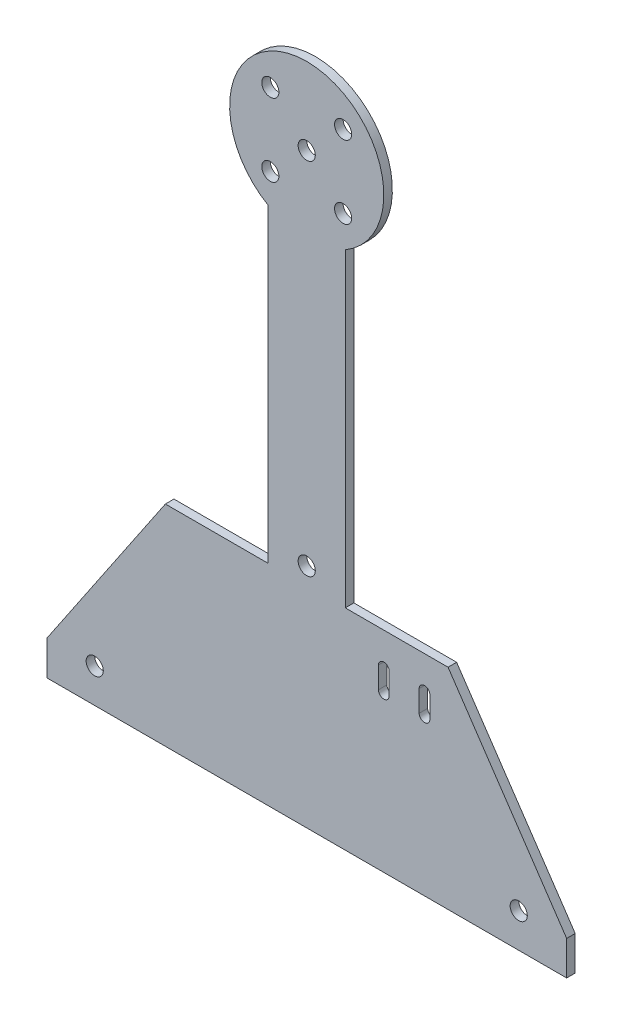
ISO-10303-21;
HEADER;
FILE_DESCRIPTION(('STEP AP214'),'2;1');
FILE_NAME('part.step','',(''),(''),'','','');
FILE_SCHEMA(('AUTOMOTIVE_DESIGN { 1 0 10303 214 1 1 1 1 }'));
ENDSEC;
DATA;
#1=APPLICATION_CONTEXT('core data for automotive mechanical design processes');
#2=APPLICATION_PROTOCOL_DEFINITION('international standard','automotive_design',2000,#1);
#3=PRODUCT_CONTEXT('',#1,'mechanical');
#4=PRODUCT('Part','Part','',(#3));
#5=PRODUCT_RELATED_PRODUCT_CATEGORY('part','',(#4));
#6=PRODUCT_DEFINITION_FORMATION('','',#4);
#7=PRODUCT_DEFINITION_CONTEXT('part definition',#1,'design');
#8=PRODUCT_DEFINITION('design','',#6,#7);
#9=PRODUCT_DEFINITION_SHAPE('','',#8);
#10=(LENGTH_UNIT() NAMED_UNIT(*) SI_UNIT(.MILLI.,.METRE.));
#11=(NAMED_UNIT(*) PLANE_ANGLE_UNIT() SI_UNIT($,.RADIAN.));
#12=(NAMED_UNIT(*) SI_UNIT($,.STERADIAN.) SOLID_ANGLE_UNIT());
#13=UNCERTAINTY_MEASURE_WITH_UNIT(LENGTH_MEASURE(1.E-05),#10,'distance_accuracy_value','');
#14=(GEOMETRIC_REPRESENTATION_CONTEXT(3) GLOBAL_UNCERTAINTY_ASSIGNED_CONTEXT((#13)) GLOBAL_UNIT_ASSIGNED_CONTEXT((#10,
#11,#12)) REPRESENTATION_CONTEXT('',''));
#15=CARTESIAN_POINT('',(0.,0.,0.));
#16=DIRECTION('',(0.,0.,1.));
#17=DIRECTION('',(1.,0.,0.));
#18=AXIS2_PLACEMENT_3D('',#15,#16,#17);
#19=CARTESIAN_POINT('',(-0.291428571428588,121.645714285714,2.));
#20=DIRECTION('',(0.,0.,-1.));
#21=DIRECTION('',(-1.,0.,0.));
#22=AXIS2_PLACEMENT_3D('',#19,#20,#21);
#23=CYLINDRICAL_SURFACE('',#22,18.);
#24=CARTESIAN_POINT('',(-0.291428571428588,121.645714285714,0.));
#25=DIRECTION('',(0.,0.,1.));
#26=DIRECTION('',(1.,0.,0.));
#27=AXIS2_PLACEMENT_3D('',#24,#25,#26);
#28=CIRCLE('',#27,18.);
#29=CARTESIAN_POINT('',(-9.29142857142858,106.057257017594,0.));
#30=VERTEX_POINT('',#29);
#31=CARTESIAN_POINT('',(8.7085714285714,106.057257017594,0.));
#32=VERTEX_POINT('',#31);
#33=EDGE_CURVE('E245',#30,#32,#28,.F.);
#34=ORIENTED_EDGE('',*,*,#33,.F.);
#35=DIRECTION('',(0.,0.,-1.));
#36=VECTOR('',#35,1.);
#37=CARTESIAN_POINT('',(-9.29142857142858,106.057257017594,2.));
#38=LINE('',#37,#36);
#39=CARTESIAN_POINT('',(-9.29142857142858,106.057257017594,2.));
#40=VERTEX_POINT('',#39);
#41=EDGE_CURVE('E11',#40,#30,#38,.T.);
#42=ORIENTED_EDGE('',*,*,#41,.F.);
#43=CARTESIAN_POINT('',(-0.291428571428588,121.645714285714,2.));
#44=DIRECTION('',(0.,0.,1.));
#45=DIRECTION('',(1.,0.,0.));
#46=AXIS2_PLACEMENT_3D('',#43,#44,#45);
#47=CIRCLE('',#46,18.);
#48=CARTESIAN_POINT('',(8.7085714285714,106.057257017594,2.));
#49=VERTEX_POINT('',#48);
#50=EDGE_CURVE('E361',#40,#49,#47,.F.);
#51=ORIENTED_EDGE('',*,*,#50,.T.);
#52=DIRECTION('',(0.,0.,-1.));
#53=VECTOR('',#52,1.);
#54=CARTESIAN_POINT('',(8.7085714285714,106.057257017594,2.));
#55=LINE('',#54,#53);
#56=EDGE_CURVE('E119',#49,#32,#55,.T.);
#57=ORIENTED_EDGE('',*,*,#56,.T.);
#58=EDGE_LOOP('',(#34,#42,#51,#57));
#59=FACE_BOUND('',#58,.T.);
#60=ADVANCED_FACE('F36',(#59),#23,.T.);
#61=CARTESIAN_POINT('',(-9.29142857142858,0.,2.));
#62=DIRECTION('',(-1.,0.,0.));
#63=DIRECTION('',(0.,0.,1.));
#64=AXIS2_PLACEMENT_3D('',#61,#62,#63);
#65=PLANE('',#64);
#66=DIRECTION('',(0.,1.,0.));
#67=VECTOR('',#66,1.);
#68=CARTESIAN_POINT('',(-9.29142857142858,0.,0.));
#69=LINE('',#68,#67);
#70=CARTESIAN_POINT('',(-9.29142857142858,33.6457142857143,0.));
#71=VERTEX_POINT('',#70);
#72=EDGE_CURVE('E248',#71,#30,#69,.T.);
#73=ORIENTED_EDGE('',*,*,#72,.F.);
#74=DIRECTION('',(0.,0.,-1.));
#75=VECTOR('',#74,1.);
#76=CARTESIAN_POINT('',(-9.29142857142858,33.6457142857143,2.));
#77=LINE('',#76,#75);
#78=CARTESIAN_POINT('',(-9.29142857142858,33.6457142857143,2.));
#79=VERTEX_POINT('',#78);
#80=EDGE_CURVE('E46',#79,#71,#77,.T.);
#81=ORIENTED_EDGE('',*,*,#80,.F.);
#82=DIRECTION('',(0.,1.,0.));
#83=VECTOR('',#82,1.);
#84=CARTESIAN_POINT('',(-9.29142857142858,0.,2.));
#85=LINE('',#84,#83);
#86=EDGE_CURVE('E363',#79,#40,#85,.T.);
#87=ORIENTED_EDGE('',*,*,#86,.T.);
#88=ORIENTED_EDGE('',*,*,#41,.T.);
#89=EDGE_LOOP('',(#73,#81,#87,#88));
#90=FACE_BOUND('',#89,.T.);
#91=ADVANCED_FACE('F386',(#90),#65,.T.);
#92=CARTESIAN_POINT('',(0.,33.6457142857143,2.));
#93=DIRECTION('',(0.,-1.,0.));
#94=DIRECTION('',(0.,0.,-1.));
#95=AXIS2_PLACEMENT_3D('',#92,#93,#94);
#96=PLANE('',#95);
#97=DIRECTION('',(-1.,0.,0.));
#98=VECTOR('',#97,1.);
#99=CARTESIAN_POINT('',(0.,33.6457142857143,0.));
#100=LINE('',#99,#98);
#101=CARTESIAN_POINT('',(-33.2914285714285,33.6457142857143,0.));
#102=VERTEX_POINT('',#101);
#103=EDGE_CURVE('E251',#71,#102,#100,.T.);
#104=ORIENTED_EDGE('',*,*,#103,.T.);
#105=DIRECTION('',(0.,0.,-1.));
#106=VECTOR('',#105,1.);
#107=CARTESIAN_POINT('',(-33.2914285714285,33.6457142857143,2.));
#108=LINE('',#107,#106);
#109=CARTESIAN_POINT('',(-33.2914285714285,33.6457142857143,2.));
#110=VERTEX_POINT('',#109);
#111=EDGE_CURVE('E305',#110,#102,#108,.T.);
#112=ORIENTED_EDGE('',*,*,#111,.F.);
#113=DIRECTION('',(-1.,0.,0.));
#114=VECTOR('',#113,1.);
#115=CARTESIAN_POINT('',(0.,33.6457142857143,2.));
#116=LINE('',#115,#114);
#117=EDGE_CURVE('E366',#79,#110,#116,.T.);
#118=ORIENTED_EDGE('',*,*,#117,.F.);
#119=ORIENTED_EDGE('',*,*,#80,.T.);
#120=EDGE_LOOP('',(#104,#112,#118,#119));
#121=FACE_BOUND('',#120,.T.);
#122=ADVANCED_FACE('F391',(#121),#96,.F.);
#123=CARTESIAN_POINT('',(-38.466867215642,25.9839493997509,2.));
#124=DIRECTION('',(0.828660684377225,-0.559751257405884,0.));
#125=DIRECTION('',(0.559751257405884,0.828660684377225,0.));
#126=AXIS2_PLACEMENT_3D('',#123,#124,#125);
#127=PLANE('',#126);
#128=DIRECTION('',(-0.559751257405884,-0.828660684377225,0.));
#129=VECTOR('',#128,1.);
#130=CARTESIAN_POINT('',(-38.466867215642,25.9839493997509,0.));
#131=LINE('',#130,#129);
#132=CARTESIAN_POINT('',(-60.9864815482557,-7.35428571428547,0.));
#133=VERTEX_POINT('',#132);
#134=EDGE_CURVE('E254',#102,#133,#131,.T.);
#135=ORIENTED_EDGE('',*,*,#134,.T.);
#136=DIRECTION('',(0.,0.,-1.));
#137=VECTOR('',#136,1.);
#138=CARTESIAN_POINT('',(-60.9864815482557,-7.35428571428547,2.));
#139=LINE('',#138,#137);
#140=CARTESIAN_POINT('',(-60.9864815482557,-7.35428571428547,2.));
#141=VERTEX_POINT('',#140);
#142=EDGE_CURVE('E302',#141,#133,#139,.T.);
#143=ORIENTED_EDGE('',*,*,#142,.F.);
#144=DIRECTION('',(-0.559751257405884,-0.828660684377225,0.));
#145=VECTOR('',#144,1.);
#146=CARTESIAN_POINT('',(-38.466867215642,25.9839493997509,2.));
#147=LINE('',#146,#145);
#148=EDGE_CURVE('E369',#110,#141,#147,.T.);
#149=ORIENTED_EDGE('',*,*,#148,.F.);
#150=ORIENTED_EDGE('',*,*,#111,.T.);
#151=EDGE_LOOP('',(#135,#143,#149,#150));
#152=FACE_BOUND('',#151,.T.);
#153=ADVANCED_FACE('F395',(#152),#127,.F.);
#154=CARTESIAN_POINT('',(-60.9864815482558,0.,2.));
#155=DIRECTION('',(1.,0.,0.));
#156=DIRECTION('',(0.,0.,-1.));
#157=AXIS2_PLACEMENT_3D('',#154,#155,#156);
#158=PLANE('',#157);
#159=DIRECTION('',(0.,-1.,0.));
#160=VECTOR('',#159,1.);
#161=CARTESIAN_POINT('',(-60.9864815482558,0.,0.));
#162=LINE('',#161,#160);
#163=CARTESIAN_POINT('',(-60.9864815482558,-15.3542857142855,0.));
#164=VERTEX_POINT('',#163);
#165=EDGE_CURVE('E257',#133,#164,#162,.T.);
#166=ORIENTED_EDGE('',*,*,#165,.T.);
#167=DIRECTION('',(0.,0.,-1.));
#168=VECTOR('',#167,1.);
#169=CARTESIAN_POINT('',(-60.9864815482558,-15.3542857142855,2.));
#170=LINE('',#169,#168);
#171=CARTESIAN_POINT('',(-60.9864815482558,-15.3542857142855,2.));
#172=VERTEX_POINT('',#171);
#173=EDGE_CURVE('E299',#172,#164,#170,.T.);
#174=ORIENTED_EDGE('',*,*,#173,.F.);
#175=DIRECTION('',(0.,-1.,0.));
#176=VECTOR('',#175,1.);
#177=CARTESIAN_POINT('',(-60.9864815482558,0.,2.));
#178=LINE('',#177,#176);
#179=EDGE_CURVE('E372',#141,#172,#178,.T.);
#180=ORIENTED_EDGE('',*,*,#179,.F.);
#181=ORIENTED_EDGE('',*,*,#142,.T.);
#182=EDGE_LOOP('',(#166,#174,#180,#181));
#183=FACE_BOUND('',#182,.T.);
#184=ADVANCED_FACE('F397',(#183),#158,.F.);
#185=CARTESIAN_POINT('',(0.,-15.3542857142855,2.));
#186=DIRECTION('',(0.,1.,0.));
#187=DIRECTION('',(0.,0.,1.));
#188=AXIS2_PLACEMENT_3D('',#185,#186,#187);
#189=PLANE('',#188);
#190=DIRECTION('',(1.,0.,0.));
#191=VECTOR('',#190,1.);
#192=CARTESIAN_POINT('',(0.,-15.3542857142855,0.));
#193=LINE('',#192,#191);
#194=CARTESIAN_POINT('',(60.4036244053986,-15.3542857142855,0.));
#195=VERTEX_POINT('',#194);
#196=EDGE_CURVE('E260',#164,#195,#193,.T.);
#197=ORIENTED_EDGE('',*,*,#196,.T.);
#198=DIRECTION('',(0.,0.,-1.));
#199=VECTOR('',#198,1.);
#200=CARTESIAN_POINT('',(60.4036244053986,-15.3542857142855,2.));
#201=LINE('',#200,#199);
#202=CARTESIAN_POINT('',(60.4036244053986,-15.3542857142855,2.));
#203=VERTEX_POINT('',#202);
#204=EDGE_CURVE('E297',#203,#195,#201,.T.);
#205=ORIENTED_EDGE('',*,*,#204,.F.);
#206=DIRECTION('',(1.,0.,0.));
#207=VECTOR('',#206,1.);
#208=CARTESIAN_POINT('',(0.,-15.3542857142855,2.));
#209=LINE('',#208,#207);
#210=EDGE_CURVE('E375',#172,#203,#209,.T.);
#211=ORIENTED_EDGE('',*,*,#210,.F.);
#212=ORIENTED_EDGE('',*,*,#173,.T.);
#213=EDGE_LOOP('',(#197,#205,#211,#212));
#214=FACE_BOUND('',#213,.T.);
#215=ADVANCED_FACE('F399',(#214),#189,.F.);
#216=CARTESIAN_POINT('',(60.4036244053986,0.,2.));
#217=DIRECTION('',(1.,0.,0.));
#218=DIRECTION('',(0.,0.,-1.));
#219=AXIS2_PLACEMENT_3D('',#216,#217,#218);
#220=PLANE('',#219);
#221=DIRECTION('',(0.,-1.,0.));
#222=VECTOR('',#221,1.);
#223=CARTESIAN_POINT('',(60.4036244053986,0.,0.));
#224=LINE('',#223,#222);
#225=CARTESIAN_POINT('',(60.4036244053986,-7.35428571428548,0.));
#226=VERTEX_POINT('',#225);
#227=EDGE_CURVE('E263',#226,#195,#224,.T.);
#228=ORIENTED_EDGE('',*,*,#227,.F.);
#229=DIRECTION('',(0.,0.,-1.));
#230=VECTOR('',#229,1.);
#231=CARTESIAN_POINT('',(60.4036244053986,-7.35428571428548,2.));
#232=LINE('',#231,#230);
#233=CARTESIAN_POINT('',(60.4036244053986,-7.35428571428548,2.));
#234=VERTEX_POINT('',#233);
#235=EDGE_CURVE('E182',#234,#226,#232,.T.);
#236=ORIENTED_EDGE('',*,*,#235,.F.);
#237=DIRECTION('',(0.,-1.,0.));
#238=VECTOR('',#237,1.);
#239=CARTESIAN_POINT('',(60.4036244053986,0.,2.));
#240=LINE('',#239,#238);
#241=EDGE_CURVE('E189',#234,#203,#240,.T.);
#242=ORIENTED_EDGE('',*,*,#241,.T.);
#243=ORIENTED_EDGE('',*,*,#204,.T.);
#244=EDGE_LOOP('',(#228,#236,#242,#243));
#245=FACE_BOUND('',#244,.T.);
#246=ADVANCED_FACE('F378',(#245),#220,.T.);
#247=CARTESIAN_POINT('',(38.0666317296824,25.7135946927544,2.));
#248=DIRECTION('',(0.828660684377225,0.559751257405884,0.));
#249=DIRECTION('',(-0.559751257405884,0.828660684377225,0.));
#250=AXIS2_PLACEMENT_3D('',#247,#248,#249);
#251=PLANE('',#250);
#252=DIRECTION('',(0.559751257405884,-0.828660684377225,0.));
#253=VECTOR('',#252,1.);
#254=CARTESIAN_POINT('',(38.0666317296824,25.7135946927544,0.));
#255=LINE('',#254,#253);
#256=CARTESIAN_POINT('',(32.7085714285713,33.6457142857143,0.));
#257=VERTEX_POINT('',#256);
#258=EDGE_CURVE('E177',#257,#226,#255,.T.);
#259=ORIENTED_EDGE('',*,*,#258,.F.);
#260=DIRECTION('',(0.,0.,-1.));
#261=VECTOR('',#260,1.);
#262=CARTESIAN_POINT('',(32.7085714285713,33.6457142857143,2.));
#263=LINE('',#262,#261);
#264=CARTESIAN_POINT('',(32.7085714285713,33.6457142857143,2.));
#265=VERTEX_POINT('',#264);
#266=EDGE_CURVE('E172',#265,#257,#263,.T.);
#267=ORIENTED_EDGE('',*,*,#266,.F.);
#268=DIRECTION('',(0.559751257405884,-0.828660684377225,0.));
#269=VECTOR('',#268,1.);
#270=CARTESIAN_POINT('',(38.0666317296824,25.7135946927544,2.));
#271=LINE('',#270,#269);
#272=EDGE_CURVE('E175',#265,#234,#271,.T.);
#273=ORIENTED_EDGE('',*,*,#272,.T.);
#274=ORIENTED_EDGE('',*,*,#235,.T.);
#275=EDGE_LOOP('',(#259,#267,#273,#274));
#276=FACE_BOUND('',#275,.T.);
#277=ADVANCED_FACE('F174',(#276),#251,.T.);
#278=CARTESIAN_POINT('',(0.,33.6457142857143,2.));
#279=DIRECTION('',(0.,1.,0.));
#280=DIRECTION('',(0.,0.,1.));
#281=AXIS2_PLACEMENT_3D('',#278,#279,#280);
#282=PLANE('',#281);
#283=DIRECTION('',(1.,0.,0.));
#284=VECTOR('',#283,1.);
#285=CARTESIAN_POINT('',(0.,33.6457142857143,0.));
#286=LINE('',#285,#284);
#287=CARTESIAN_POINT('',(8.7085714285714,33.6457142857143,0.));
#288=VERTEX_POINT('',#287);
#289=EDGE_CURVE('E267',#288,#257,#286,.T.);
#290=ORIENTED_EDGE('',*,*,#289,.F.);
#291=DIRECTION('',(0.,0.,-1.));
#292=VECTOR('',#291,1.);
#293=CARTESIAN_POINT('',(8.7085714285714,33.6457142857143,2.));
#294=LINE('',#293,#292);
#295=CARTESIAN_POINT('',(8.7085714285714,33.6457142857143,2.));
#296=VERTEX_POINT('',#295);
#297=EDGE_CURVE('E112',#296,#288,#294,.T.);
#298=ORIENTED_EDGE('',*,*,#297,.F.);
#299=DIRECTION('',(1.,0.,0.));
#300=VECTOR('',#299,1.);
#301=CARTESIAN_POINT('',(0.,33.6457142857143,2.));
#302=LINE('',#301,#300);
#303=EDGE_CURVE('E187',#296,#265,#302,.T.);
#304=ORIENTED_EDGE('',*,*,#303,.T.);
#305=ORIENTED_EDGE('',*,*,#266,.T.);
#306=EDGE_LOOP('',(#290,#298,#304,#305));
#307=FACE_BOUND('',#306,.T.);
#308=ADVANCED_FACE('F191',(#307),#282,.T.);
#309=CARTESIAN_POINT('',(17.7031309841158,20.9457142857143,2.));
#310=DIRECTION('',(0.,0.,-1.));
#311=DIRECTION('',(-1.,0.,0.));
#312=AXIS2_PLACEMENT_3D('',#309,#310,#311);
#313=CYLINDRICAL_SURFACE('',#312,1.25);
#314=CARTESIAN_POINT('',(17.7031309841158,20.9457142857143,0.));
#315=DIRECTION('',(0.,0.,1.));
#316=DIRECTION('',(1.,0.,0.));
#317=AXIS2_PLACEMENT_3D('',#314,#315,#316);
#318=CIRCLE('',#317,1.25);
#319=CARTESIAN_POINT('',(16.4531309841158,20.9457142857143,0.));
#320=VERTEX_POINT('',#319);
#321=CARTESIAN_POINT('',(18.9531309841158,20.9457142857143,0.));
#322=VERTEX_POINT('',#321);
#323=EDGE_CURVE('E230',#320,#322,#318,.T.);
#324=ORIENTED_EDGE('',*,*,#323,.F.);
#325=DIRECTION('',(0.,0.,-1.));
#326=VECTOR('',#325,1.);
#327=CARTESIAN_POINT('',(16.4531309841158,20.9457142857143,2.));
#328=LINE('',#327,#326);
#329=CARTESIAN_POINT('',(16.4531309841158,20.9457142857143,2.));
#330=VERTEX_POINT('',#329);
#331=EDGE_CURVE('E294',#330,#320,#328,.T.);
#332=ORIENTED_EDGE('',*,*,#331,.F.);
#333=CARTESIAN_POINT('',(17.7031309841158,20.9457142857143,2.));
#334=DIRECTION('',(0.,0.,1.));
#335=DIRECTION('',(1.,0.,0.));
#336=AXIS2_PLACEMENT_3D('',#333,#334,#335);
#337=CIRCLE('',#336,1.25);
#338=CARTESIAN_POINT('',(18.9531309841158,20.9457142857143,2.));
#339=VERTEX_POINT('',#338);
#340=EDGE_CURVE('E341',#330,#339,#337,.T.);
#341=ORIENTED_EDGE('',*,*,#340,.T.);
#342=DIRECTION('',(0.,0.,-1.));
#343=VECTOR('',#342,1.);
#344=CARTESIAN_POINT('',(18.9531309841158,20.9457142857143,2.));
#345=LINE('',#344,#343);
#346=EDGE_CURVE('E309',#339,#322,#345,.T.);
#347=ORIENTED_EDGE('',*,*,#346,.T.);
#348=EDGE_LOOP('',(#324,#332,#341,#347));
#349=FACE_BOUND('',#348,.T.);
#350=ADVANCED_FACE('F431',(#349),#313,.F.);
#351=CARTESIAN_POINT('',(16.4531309841158,0.,2.));
#352=DIRECTION('',(1.,0.,0.));
#353=DIRECTION('',(0.,0.,-1.));
#354=AXIS2_PLACEMENT_3D('',#351,#352,#353);
#355=PLANE('',#354);
#356=DIRECTION('',(0.,-1.,0.));
#357=VECTOR('',#356,1.);
#358=CARTESIAN_POINT('',(16.4531309841158,0.,0.));
#359=LINE('',#358,#357);
#360=CARTESIAN_POINT('',(16.4531309841158,25.9457142857143,0.));
#361=VERTEX_POINT('',#360);
#362=EDGE_CURVE('E233',#361,#320,#359,.T.);
#363=ORIENTED_EDGE('',*,*,#362,.F.);
#364=DIRECTION('',(0.,0.,-1.));
#365=VECTOR('',#364,1.);
#366=CARTESIAN_POINT('',(16.4531309841158,25.9457142857143,2.));
#367=LINE('',#366,#365);
#368=CARTESIAN_POINT('',(16.4531309841158,25.9457142857143,2.));
#369=VERTEX_POINT('',#368);
#370=EDGE_CURVE('E313',#369,#361,#367,.T.);
#371=ORIENTED_EDGE('',*,*,#370,.F.);
#372=DIRECTION('',(0.,-1.,0.));
#373=VECTOR('',#372,1.);
#374=CARTESIAN_POINT('',(16.4531309841158,0.,2.));
#375=LINE('',#374,#373);
#376=EDGE_CURVE('E350',#369,#330,#375,.T.);
#377=ORIENTED_EDGE('',*,*,#376,.T.);
#378=ORIENTED_EDGE('',*,*,#331,.T.);
#379=EDGE_LOOP('',(#363,#371,#377,#378));
#380=FACE_BOUND('',#379,.T.);
#381=ADVANCED_FACE('F427',(#380),#355,.T.);
#382=CARTESIAN_POINT('',(17.7031309841158,25.9457142857143,2.));
#383=DIRECTION('',(0.,0.,-1.));
#384=DIRECTION('',(-1.,0.,0.));
#385=AXIS2_PLACEMENT_3D('',#382,#383,#384);
#386=CYLINDRICAL_SURFACE('',#385,1.25);
#387=CARTESIAN_POINT('',(17.7031309841158,25.9457142857143,0.));
#388=DIRECTION('',(0.,0.,1.));
#389=DIRECTION('',(1.,0.,0.));
#390=AXIS2_PLACEMENT_3D('',#387,#388,#389);
#391=CIRCLE('',#390,1.25);
#392=CARTESIAN_POINT('',(18.9531309841158,25.9457142857143,0.));
#393=VERTEX_POINT('',#392);
#394=EDGE_CURVE('E236',#393,#361,#391,.T.);
#395=ORIENTED_EDGE('',*,*,#394,.F.);
#396=DIRECTION('',(0.,0.,-1.));
#397=VECTOR('',#396,1.);
#398=CARTESIAN_POINT('',(18.9531309841158,25.9457142857143,2.));
#399=LINE('',#398,#397);
#400=CARTESIAN_POINT('',(18.9531309841158,25.9457142857143,2.));
#401=VERTEX_POINT('',#400);
#402=EDGE_CURVE('E311',#401,#393,#399,.T.);
#403=ORIENTED_EDGE('',*,*,#402,.F.);
#404=CARTESIAN_POINT('',(17.7031309841158,25.9457142857143,2.));
#405=DIRECTION('',(0.,0.,1.));
#406=DIRECTION('',(1.,0.,0.));
#407=AXIS2_PLACEMENT_3D('',#404,#405,#406);
#408=CIRCLE('',#407,1.25);
#409=EDGE_CURVE('E353',#401,#369,#408,.T.);
#410=ORIENTED_EDGE('',*,*,#409,.T.);
#411=ORIENTED_EDGE('',*,*,#370,.T.);
#412=EDGE_LOOP('',(#395,#403,#410,#411));
#413=FACE_BOUND('',#412,.T.);
#414=ADVANCED_FACE('F424',(#413),#386,.F.);
#415=CARTESIAN_POINT('',(27.2031309841158,20.9457142857143,2.));
#416=DIRECTION('',(0.,0.,-1.));
#417=DIRECTION('',(-1.,0.,0.));
#418=AXIS2_PLACEMENT_3D('',#415,#416,#417);
#419=CYLINDRICAL_SURFACE('',#418,1.25);
#420=CARTESIAN_POINT('',(27.2031309841158,20.9457142857143,0.));
#421=DIRECTION('',(0.,0.,1.));
#422=DIRECTION('',(1.,0.,0.));
#423=AXIS2_PLACEMENT_3D('',#420,#421,#422);
#424=CIRCLE('',#423,1.25);
#425=CARTESIAN_POINT('',(25.9531309841158,20.9457142857143,0.));
#426=VERTEX_POINT('',#425);
#427=CARTESIAN_POINT('',(28.4531309841158,20.9457142857143,0.));
#428=VERTEX_POINT('',#427);
#429=EDGE_CURVE('E218',#426,#428,#424,.T.);
#430=ORIENTED_EDGE('',*,*,#429,.F.);
#431=DIRECTION('',(0.,0.,-1.));
#432=VECTOR('',#431,1.);
#433=CARTESIAN_POINT('',(25.9531309841158,20.9457142857143,2.));
#434=LINE('',#433,#432);
#435=CARTESIAN_POINT('',(25.9531309841158,20.9457142857143,2.));
#436=VERTEX_POINT('',#435);
#437=EDGE_CURVE('E40',#436,#426,#434,.T.);
#438=ORIENTED_EDGE('',*,*,#437,.F.);
#439=CARTESIAN_POINT('',(27.2031309841158,20.9457142857143,2.));
#440=DIRECTION('',(0.,0.,1.));
#441=DIRECTION('',(1.,0.,0.));
#442=AXIS2_PLACEMENT_3D('',#439,#440,#441);
#443=CIRCLE('',#442,1.25);
#444=CARTESIAN_POINT('',(28.4531309841158,20.9457142857143,2.));
#445=VERTEX_POINT('',#444);
#446=EDGE_CURVE('E292',#436,#445,#443,.T.);
#447=ORIENTED_EDGE('',*,*,#446,.T.);
#448=DIRECTION('',(0.,0.,-1.));
#449=VECTOR('',#448,1.);
#450=CARTESIAN_POINT('',(28.4531309841158,20.9457142857143,2.));
#451=LINE('',#450,#449);
#452=EDGE_CURVE('E217',#445,#428,#451,.T.);
#453=ORIENTED_EDGE('',*,*,#452,.T.);
#454=EDGE_LOOP('',(#430,#438,#447,#453));
#455=FACE_BOUND('',#454,.T.);
#456=ADVANCED_FACE('F38',(#455),#419,.F.);
#457=CARTESIAN_POINT('',(25.9531309841158,0.,2.));
#458=DIRECTION('',(1.,0.,0.));
#459=DIRECTION('',(0.,0.,-1.));
#460=AXIS2_PLACEMENT_3D('',#457,#458,#459);
#461=PLANE('',#460);
#462=DIRECTION('',(0.,-1.,0.));
#463=VECTOR('',#462,1.);
#464=CARTESIAN_POINT('',(25.9531309841158,0.,0.));
#465=LINE('',#464,#463);
#466=CARTESIAN_POINT('',(25.9531309841158,25.9457142857143,0.));
#467=VERTEX_POINT('',#466);
#468=EDGE_CURVE('E221',#467,#426,#465,.T.);
#469=ORIENTED_EDGE('',*,*,#468,.F.);
#470=DIRECTION('',(0.,0.,-1.));
#471=VECTOR('',#470,1.);
#472=CARTESIAN_POINT('',(25.9531309841158,25.9457142857143,2.));
#473=LINE('',#472,#471);
#474=CARTESIAN_POINT('',(25.9531309841158,25.9457142857143,2.));
#475=VERTEX_POINT('',#474);
#476=EDGE_CURVE('E318',#475,#467,#473,.T.);
#477=ORIENTED_EDGE('',*,*,#476,.F.);
#478=DIRECTION('',(0.,-1.,0.));
#479=VECTOR('',#478,1.);
#480=CARTESIAN_POINT('',(25.9531309841158,0.,2.));
#481=LINE('',#480,#479);
#482=EDGE_CURVE('E327',#475,#436,#481,.T.);
#483=ORIENTED_EDGE('',*,*,#482,.T.);
#484=ORIENTED_EDGE('',*,*,#437,.T.);
#485=EDGE_LOOP('',(#469,#477,#483,#484));
#486=FACE_BOUND('',#485,.T.);
#487=ADVANCED_FACE('F325',(#486),#461,.T.);
#488=CARTESIAN_POINT('',(27.2031309841158,25.9457142857143,2.));
#489=DIRECTION('',(0.,0.,-1.));
#490=DIRECTION('',(-1.,0.,0.));
#491=AXIS2_PLACEMENT_3D('',#488,#489,#490);
#492=CYLINDRICAL_SURFACE('',#491,1.25);
#493=CARTESIAN_POINT('',(27.2031309841158,25.9457142857143,0.));
#494=DIRECTION('',(0.,0.,1.));
#495=DIRECTION('',(1.,0.,0.));
#496=AXIS2_PLACEMENT_3D('',#493,#494,#495);
#497=CIRCLE('',#496,1.25);
#498=CARTESIAN_POINT('',(28.4531309841158,25.9457142857143,0.));
#499=VERTEX_POINT('',#498);
#500=EDGE_CURVE('E224',#499,#467,#497,.T.);
#501=ORIENTED_EDGE('',*,*,#500,.F.);
#502=DIRECTION('',(0.,0.,-1.));
#503=VECTOR('',#502,1.);
#504=CARTESIAN_POINT('',(28.4531309841158,25.9457142857143,2.));
#505=LINE('',#504,#503);
#506=CARTESIAN_POINT('',(28.4531309841158,25.9457142857143,2.));
#507=VERTEX_POINT('',#506);
#508=EDGE_CURVE('E317',#507,#499,#505,.T.);
#509=ORIENTED_EDGE('',*,*,#508,.F.);
#510=CARTESIAN_POINT('',(27.2031309841158,25.9457142857143,2.));
#511=DIRECTION('',(0.,0.,1.));
#512=DIRECTION('',(1.,0.,0.));
#513=AXIS2_PLACEMENT_3D('',#510,#511,#512);
#514=CIRCLE('',#513,1.25);
#515=EDGE_CURVE('E336',#507,#475,#514,.T.);
#516=ORIENTED_EDGE('',*,*,#515,.T.);
#517=ORIENTED_EDGE('',*,*,#476,.T.);
#518=EDGE_LOOP('',(#501,#509,#516,#517));
#519=FACE_BOUND('',#518,.T.);
#520=ADVANCED_FACE('F333',(#519),#492,.F.);
#521=CARTESIAN_POINT('',(49.2085714285714,-7.3542857142857,2.));
#522=DIRECTION('',(0.,0.,-1.));
#523=DIRECTION('',(-1.,0.,0.));
#524=AXIS2_PLACEMENT_3D('',#521,#522,#523);
#525=CYLINDRICAL_SURFACE('',#524,2.);
#526=CARTESIAN_POINT('',(49.2085714285714,-7.3542857142857,2.));
#527=DIRECTION('',(0.,0.,1.));
#528=DIRECTION('',(1.,0.,0.));
#529=AXIS2_PLACEMENT_3D('',#526,#527,#528);
#530=CIRCLE('',#529,2.);
#531=CARTESIAN_POINT('',(51.2085714285714,-7.3542857142857,2.));
#532=VERTEX_POINT('',#531);
#533=EDGE_CURVE('E211',#532,#532,#530,.T.);
#534=ORIENTED_EDGE('',*,*,#533,.T.);
#535=EDGE_LOOP('',(#534));
#536=FACE_BOUND('',#535,.T.);
#537=CARTESIAN_POINT('',(49.2085714285714,-7.3542857142857,0.));
#538=DIRECTION('',(0.,0.,1.));
#539=DIRECTION('',(1.,0.,0.));
#540=AXIS2_PLACEMENT_3D('',#537,#538,#539);
#541=CIRCLE('',#540,2.);
#542=CARTESIAN_POINT('',(51.2085714285714,-7.3542857142857,0.));
#543=VERTEX_POINT('',#542);
#544=EDGE_CURVE('E286',#543,#543,#541,.T.);
#545=ORIENTED_EDGE('',*,*,#544,.F.);
#546=EDGE_LOOP('',(#545));
#547=FACE_BOUND('',#546,.T.);
#548=ADVANCED_FACE('F440',(#536,#547),#525,.F.);
#549=CARTESIAN_POINT('',(8.20857142857141,130.145714285714,2.));
#550=DIRECTION('',(0.,0.,-1.));
#551=DIRECTION('',(-1.,0.,0.));
#552=AXIS2_PLACEMENT_3D('',#549,#550,#551);
#553=CYLINDRICAL_SURFACE('',#552,2.);
#554=CARTESIAN_POINT('',(8.20857142857141,130.145714285714,2.));
#555=DIRECTION('',(0.,0.,1.));
#556=DIRECTION('',(1.,0.,0.));
#557=AXIS2_PLACEMENT_3D('',#554,#555,#556);
#558=CIRCLE('',#557,2.);
#559=CARTESIAN_POINT('',(10.2085714285714,130.145714285714,2.));
#560=VERTEX_POINT('',#559);
#561=EDGE_CURVE('E208',#560,#560,#558,.T.);
#562=ORIENTED_EDGE('',*,*,#561,.T.);
#563=EDGE_LOOP('',(#562));
#564=FACE_BOUND('',#563,.T.);
#565=CARTESIAN_POINT('',(8.20857142857141,130.145714285714,0.));
#566=DIRECTION('',(0.,0.,1.));
#567=DIRECTION('',(1.,0.,0.));
#568=AXIS2_PLACEMENT_3D('',#565,#566,#567);
#569=CIRCLE('',#568,2.);
#570=CARTESIAN_POINT('',(10.2085714285714,130.145714285714,0.));
#571=VERTEX_POINT('',#570);
#572=EDGE_CURVE('E283',#571,#571,#569,.T.);
#573=ORIENTED_EDGE('',*,*,#572,.F.);
#574=EDGE_LOOP('',(#573));
#575=FACE_BOUND('',#574,.T.);
#576=ADVANCED_FACE('F544',(#564,#575),#553,.F.);
#577=CARTESIAN_POINT('',(-0.291428571428588,37.6457142857143,2.));
#578=DIRECTION('',(0.,0.,-1.));
#579=DIRECTION('',(-1.,0.,0.));
#580=AXIS2_PLACEMENT_3D('',#577,#578,#579);
#581=CYLINDRICAL_SURFACE('',#580,2.);
#582=CARTESIAN_POINT('',(-0.291428571428588,37.6457142857143,2.));
#583=DIRECTION('',(0.,0.,1.));
#584=DIRECTION('',(1.,0.,0.));
#585=AXIS2_PLACEMENT_3D('',#582,#583,#584);
#586=CIRCLE('',#585,2.);
#587=CARTESIAN_POINT('',(1.70857142857141,37.6457142857143,2.));
#588=VERTEX_POINT('',#587);
#589=EDGE_CURVE('E205',#588,#588,#586,.T.);
#590=ORIENTED_EDGE('',*,*,#589,.T.);
#591=EDGE_LOOP('',(#590));
#592=FACE_BOUND('',#591,.T.);
#593=CARTESIAN_POINT('',(-0.291428571428588,37.6457142857143,0.));
#594=DIRECTION('',(0.,0.,1.));
#595=DIRECTION('',(1.,0.,0.));
#596=AXIS2_PLACEMENT_3D('',#593,#594,#595);
#597=CIRCLE('',#596,2.);
#598=CARTESIAN_POINT('',(1.70857142857141,37.6457142857143,0.));
#599=VERTEX_POINT('',#598);
#600=EDGE_CURVE('E280',#599,#599,#597,.T.);
#601=ORIENTED_EDGE('',*,*,#600,.F.);
#602=EDGE_LOOP('',(#601));
#603=FACE_BOUND('',#602,.T.);
#604=ADVANCED_FACE('F553',(#592,#603),#581,.F.);
#605=CARTESIAN_POINT('',(8.20857142857163,113.145714285714,2.));
#606=DIRECTION('',(0.,0.,-1.));
#607=DIRECTION('',(-1.,0.,0.));
#608=AXIS2_PLACEMENT_3D('',#605,#606,#607);
#609=CYLINDRICAL_SURFACE('',#608,2.);
#610=CARTESIAN_POINT('',(8.20857142857163,113.145714285714,2.));
#611=DIRECTION('',(0.,0.,1.));
#612=DIRECTION('',(1.,0.,0.));
#613=AXIS2_PLACEMENT_3D('',#610,#611,#612);
#614=CIRCLE('',#613,2.);
#615=CARTESIAN_POINT('',(10.2085714285716,113.145714285714,2.));
#616=VERTEX_POINT('',#615);
#617=EDGE_CURVE('E202',#616,#616,#614,.T.);
#618=ORIENTED_EDGE('',*,*,#617,.T.);
#619=EDGE_LOOP('',(#618));
#620=FACE_BOUND('',#619,.T.);
#621=CARTESIAN_POINT('',(8.20857142857163,113.145714285714,0.));
#622=DIRECTION('',(0.,0.,1.));
#623=DIRECTION('',(1.,0.,0.));
#624=AXIS2_PLACEMENT_3D('',#621,#622,#623);
#625=CIRCLE('',#624,2.);
#626=CARTESIAN_POINT('',(10.2085714285716,113.145714285714,0.));
#627=VERTEX_POINT('',#626);
#628=EDGE_CURVE('E277',#627,#627,#625,.T.);
#629=ORIENTED_EDGE('',*,*,#628,.F.);
#630=EDGE_LOOP('',(#629));
#631=FACE_BOUND('',#630,.T.);
#632=ADVANCED_FACE('F562',(#620,#631),#609,.F.);
#633=CARTESIAN_POINT('',(-8.7914285714284,113.145714285714,2.));
#634=DIRECTION('',(0.,0.,-1.));
#635=DIRECTION('',(-1.,0.,0.));
#636=AXIS2_PLACEMENT_3D('',#633,#634,#635);
#637=CYLINDRICAL_SURFACE('',#636,2.);
#638=CARTESIAN_POINT('',(-8.7914285714284,113.145714285714,2.));
#639=DIRECTION('',(0.,0.,1.));
#640=DIRECTION('',(1.,0.,0.));
#641=AXIS2_PLACEMENT_3D('',#638,#639,#640);
#642=CIRCLE('',#641,2.);
#643=CARTESIAN_POINT('',(-6.79142857142841,113.145714285714,2.));
#644=VERTEX_POINT('',#643);
#645=EDGE_CURVE('E199',#644,#644,#642,.T.);
#646=ORIENTED_EDGE('',*,*,#645,.T.);
#647=EDGE_LOOP('',(#646));
#648=FACE_BOUND('',#647,.T.);
#649=CARTESIAN_POINT('',(-8.7914285714284,113.145714285714,0.));
#650=DIRECTION('',(0.,0.,1.));
#651=DIRECTION('',(1.,0.,0.));
#652=AXIS2_PLACEMENT_3D('',#649,#650,#651);
#653=CIRCLE('',#652,2.);
#654=CARTESIAN_POINT('',(-6.79142857142841,113.145714285714,0.));
#655=VERTEX_POINT('',#654);
#656=EDGE_CURVE('E274',#655,#655,#653,.T.);
#657=ORIENTED_EDGE('',*,*,#656,.F.);
#658=EDGE_LOOP('',(#657));
#659=FACE_BOUND('',#658,.T.);
#660=ADVANCED_FACE('F571',(#648,#659),#637,.F.);
#661=CARTESIAN_POINT('',(-8.79142857142853,130.145714285714,2.));
#662=DIRECTION('',(0.,0.,-1.));
#663=DIRECTION('',(-1.,0.,0.));
#664=AXIS2_PLACEMENT_3D('',#661,#662,#663);
#665=CYLINDRICAL_SURFACE('',#664,1.99999999999999);
#666=CARTESIAN_POINT('',(-8.79142857142853,130.145714285714,2.));
#667=DIRECTION('',(0.,0.,1.));
#668=DIRECTION('',(1.,0.,0.));
#669=AXIS2_PLACEMENT_3D('',#666,#667,#668);
#670=CIRCLE('',#669,1.99999999999999);
#671=CARTESIAN_POINT('',(-6.79142857142855,130.145714285714,2.));
#672=VERTEX_POINT('',#671);
#673=EDGE_CURVE('E193',#672,#672,#670,.T.);
#674=ORIENTED_EDGE('',*,*,#673,.T.);
#675=EDGE_LOOP('',(#674));
#676=FACE_BOUND('',#675,.T.);
#677=CARTESIAN_POINT('',(-8.79142857142853,130.145714285714,0.));
#678=DIRECTION('',(0.,0.,1.));
#679=DIRECTION('',(1.,0.,0.));
#680=AXIS2_PLACEMENT_3D('',#677,#678,#679);
#681=CIRCLE('',#680,1.99999999999999);
#682=CARTESIAN_POINT('',(-6.79142857142855,130.145714285714,0.));
#683=VERTEX_POINT('',#682);
#684=EDGE_CURVE('E271',#683,#683,#681,.T.);
#685=ORIENTED_EDGE('',*,*,#684,.F.);
#686=EDGE_LOOP('',(#685));
#687=FACE_BOUND('',#686,.T.);
#688=ADVANCED_FACE('F580',(#676,#687),#665,.F.);
#689=CARTESIAN_POINT('',(8.7085714285714,0.,2.));
#690=DIRECTION('',(-1.,0.,0.));
#691=DIRECTION('',(0.,0.,1.));
#692=AXIS2_PLACEMENT_3D('',#689,#690,#691);
#693=PLANE('',#692);
#694=DIRECTION('',(0.,1.,0.));
#695=VECTOR('',#694,1.);
#696=CARTESIAN_POINT('',(8.7085714285714,0.,0.));
#697=LINE('',#696,#695);
#698=EDGE_CURVE('E269',#288,#32,#697,.T.);
#699=ORIENTED_EDGE('',*,*,#698,.T.);
#700=ORIENTED_EDGE('',*,*,#56,.F.);
#701=DIRECTION('',(0.,1.,0.));
#702=VECTOR('',#701,1.);
#703=CARTESIAN_POINT('',(8.7085714285714,0.,2.));
#704=LINE('',#703,#702);
#705=EDGE_CURVE('E55',#296,#49,#704,.T.);
#706=ORIENTED_EDGE('',*,*,#705,.F.);
#707=ORIENTED_EDGE('',*,*,#297,.T.);
#708=EDGE_LOOP('',(#699,#700,#706,#707));
#709=FACE_BOUND('',#708,.T.);
#710=ADVANCED_FACE('F382',(#709),#693,.F.);
#711=CARTESIAN_POINT('',(-0.291428571428588,121.645714285714,2.));
#712=DIRECTION('',(0.,0.,-1.));
#713=DIRECTION('',(-1.,0.,0.));
#714=AXIS2_PLACEMENT_3D('',#711,#712,#713);
#715=CYLINDRICAL_SURFACE('',#714,2.);
#716=CARTESIAN_POINT('',(-0.291428571428588,121.645714285714,2.));
#717=DIRECTION('',(0.,0.,1.));
#718=DIRECTION('',(1.,0.,0.));
#719=AXIS2_PLACEMENT_3D('',#716,#717,#718);
#720=CIRCLE('',#719,2.);
#721=CARTESIAN_POINT('',(1.70857142857141,121.645714285714,2.));
#722=VERTEX_POINT('',#721);
#723=EDGE_CURVE('E358',#722,#722,#720,.T.);
#724=ORIENTED_EDGE('',*,*,#723,.T.);
#725=EDGE_LOOP('',(#724));
#726=FACE_BOUND('',#725,.T.);
#727=CARTESIAN_POINT('',(-0.291428571428588,121.645714285714,0.));
#728=DIRECTION('',(0.,0.,1.));
#729=DIRECTION('',(1.,0.,0.));
#730=AXIS2_PLACEMENT_3D('',#727,#728,#729);
#731=CIRCLE('',#730,2.);
#732=CARTESIAN_POINT('',(1.70857142857141,121.645714285714,0.));
#733=VERTEX_POINT('',#732);
#734=EDGE_CURVE('E242',#733,#733,#731,.T.);
#735=ORIENTED_EDGE('',*,*,#734,.F.);
#736=EDGE_LOOP('',(#735));
#737=FACE_BOUND('',#736,.T.);
#738=ADVANCED_FACE('F416',(#726,#737),#715,.F.);
#739=CARTESIAN_POINT('',(18.9531309841158,0.,2.));
#740=DIRECTION('',(1.,0.,0.));
#741=DIRECTION('',(0.,0.,-1.));
#742=AXIS2_PLACEMENT_3D('',#739,#740,#741);
#743=PLANE('',#742);
#744=DIRECTION('',(0.,-1.,0.));
#745=VECTOR('',#744,1.);
#746=CARTESIAN_POINT('',(18.9531309841158,0.,0.));
#747=LINE('',#746,#745);
#748=EDGE_CURVE('E239',#393,#322,#747,.T.);
#749=ORIENTED_EDGE('',*,*,#748,.T.);
#750=ORIENTED_EDGE('',*,*,#346,.F.);
#751=DIRECTION('',(0.,-1.,0.));
#752=VECTOR('',#751,1.);
#753=CARTESIAN_POINT('',(18.9531309841158,0.,2.));
#754=LINE('',#753,#752);
#755=EDGE_CURVE('E356',#401,#339,#754,.T.);
#756=ORIENTED_EDGE('',*,*,#755,.F.);
#757=ORIENTED_EDGE('',*,*,#402,.T.);
#758=EDGE_LOOP('',(#749,#750,#756,#757));
#759=FACE_BOUND('',#758,.T.);
#760=ADVANCED_FACE('F419',(#759),#743,.F.);
#761=CARTESIAN_POINT('',(28.4531309841158,0.,2.));
#762=DIRECTION('',(1.,0.,0.));
#763=DIRECTION('',(0.,0.,-1.));
#764=AXIS2_PLACEMENT_3D('',#761,#762,#763);
#765=PLANE('',#764);
#766=DIRECTION('',(0.,-1.,0.));
#767=VECTOR('',#766,1.);
#768=CARTESIAN_POINT('',(28.4531309841158,0.,0.));
#769=LINE('',#768,#767);
#770=EDGE_CURVE('E227',#499,#428,#769,.T.);
#771=ORIENTED_EDGE('',*,*,#770,.T.);
#772=ORIENTED_EDGE('',*,*,#452,.F.);
#773=DIRECTION('',(0.,-1.,0.));
#774=VECTOR('',#773,1.);
#775=CARTESIAN_POINT('',(28.4531309841158,0.,2.));
#776=LINE('',#775,#774);
#777=EDGE_CURVE('E338',#507,#445,#776,.T.);
#778=ORIENTED_EDGE('',*,*,#777,.F.);
#779=ORIENTED_EDGE('',*,*,#508,.T.);
#780=EDGE_LOOP('',(#771,#772,#778,#779));
#781=FACE_BOUND('',#780,.T.);
#782=ADVANCED_FACE('F339',(#781),#765,.F.);
#783=CARTESIAN_POINT('',(-49.7914285714285,-7.35428571428548,2.));
#784=DIRECTION('',(0.,0.,-1.));
#785=DIRECTION('',(-1.,0.,0.));
#786=AXIS2_PLACEMENT_3D('',#783,#784,#785);
#787=CYLINDRICAL_SURFACE('',#786,2.);
#788=CARTESIAN_POINT('',(-49.7914285714285,-7.35428571428548,2.));
#789=DIRECTION('',(0.,0.,1.));
#790=DIRECTION('',(1.,0.,0.));
#791=AXIS2_PLACEMENT_3D('',#788,#789,#790);
#792=CIRCLE('',#791,2.);
#793=CARTESIAN_POINT('',(-47.7914285714285,-7.35428571428548,2.));
#794=VERTEX_POINT('',#793);
#795=EDGE_CURVE('E214',#794,#794,#792,.F.);
#796=ORIENTED_EDGE('',*,*,#795,.F.);
#797=EDGE_LOOP('',(#796));
#798=FACE_BOUND('',#797,.T.);
#799=CARTESIAN_POINT('',(-49.7914285714285,-7.35428571428548,0.));
#800=DIRECTION('',(0.,0.,1.));
#801=DIRECTION('',(1.,0.,0.));
#802=AXIS2_PLACEMENT_3D('',#799,#800,#801);
#803=CIRCLE('',#802,2.);
#804=CARTESIAN_POINT('',(-47.7914285714285,-7.35428571428548,0.));
#805=VERTEX_POINT('',#804);
#806=EDGE_CURVE('E289',#805,#805,#803,.F.);
#807=ORIENTED_EDGE('',*,*,#806,.T.);
#808=EDGE_LOOP('',(#807));
#809=FACE_BOUND('',#808,.T.);
#810=ADVANCED_FACE('F438',(#798,#809),#787,.F.);
#811=CARTESIAN_POINT('',(0.,0.,2.));
#812=DIRECTION('',(0.,0.,1.));
#813=DIRECTION('',(1.,0.,0.));
#814=AXIS2_PLACEMENT_3D('',#811,#812,#813);
#815=PLANE('',#814);
#816=ORIENTED_EDGE('',*,*,#446,.F.);
#817=ORIENTED_EDGE('',*,*,#482,.F.);
#818=ORIENTED_EDGE('',*,*,#515,.F.);
#819=ORIENTED_EDGE('',*,*,#777,.T.);
#820=EDGE_LOOP('',(#816,#817,#818,#819));
#821=FACE_BOUND('',#820,.T.);
#822=ORIENTED_EDGE('',*,*,#340,.F.);
#823=ORIENTED_EDGE('',*,*,#376,.F.);
#824=ORIENTED_EDGE('',*,*,#409,.F.);
#825=ORIENTED_EDGE('',*,*,#755,.T.);
#826=EDGE_LOOP('',(#822,#823,#824,#825));
#827=FACE_BOUND('',#826,.T.);
#828=ORIENTED_EDGE('',*,*,#723,.F.);
#829=EDGE_LOOP('',(#828));
#830=FACE_BOUND('',#829,.T.);
#831=ORIENTED_EDGE('',*,*,#50,.F.);
#832=ORIENTED_EDGE('',*,*,#86,.F.);
#833=ORIENTED_EDGE('',*,*,#117,.T.);
#834=ORIENTED_EDGE('',*,*,#148,.T.);
#835=ORIENTED_EDGE('',*,*,#179,.T.);
#836=ORIENTED_EDGE('',*,*,#210,.T.);
#837=ORIENTED_EDGE('',*,*,#241,.F.);
#838=ORIENTED_EDGE('',*,*,#272,.F.);
#839=ORIENTED_EDGE('',*,*,#303,.F.);
#840=ORIENTED_EDGE('',*,*,#705,.T.);
#841=EDGE_LOOP('',(#831,#832,#833,#834,#835,#836,#837,#838,#839,#840));
#842=FACE_BOUND('',#841,.T.);
#843=ORIENTED_EDGE('',*,*,#673,.F.);
#844=EDGE_LOOP('',(#843));
#845=FACE_BOUND('',#844,.T.);
#846=ORIENTED_EDGE('',*,*,#645,.F.);
#847=EDGE_LOOP('',(#846));
#848=FACE_BOUND('',#847,.T.);
#849=ORIENTED_EDGE('',*,*,#617,.F.);
#850=EDGE_LOOP('',(#849));
#851=FACE_BOUND('',#850,.T.);
#852=ORIENTED_EDGE('',*,*,#589,.F.);
#853=EDGE_LOOP('',(#852));
#854=FACE_BOUND('',#853,.T.);
#855=ORIENTED_EDGE('',*,*,#561,.F.);
#856=EDGE_LOOP('',(#855));
#857=FACE_BOUND('',#856,.T.);
#858=ORIENTED_EDGE('',*,*,#533,.F.);
#859=EDGE_LOOP('',(#858));
#860=FACE_BOUND('',#859,.T.);
#861=ORIENTED_EDGE('',*,*,#795,.T.);
#862=EDGE_LOOP('',(#861));
#863=FACE_BOUND('',#862,.T.);
#864=ADVANCED_FACE('F185',(#821,#827,#830,#842,#845,#848,#851,#854,#857,#860,#863),#815,.T.);
#865=CARTESIAN_POINT('',(0.,0.,0.));
#866=DIRECTION('',(0.,0.,1.));
#867=DIRECTION('',(1.,0.,0.));
#868=AXIS2_PLACEMENT_3D('',#865,#866,#867);
#869=PLANE('',#868);
#870=ORIENTED_EDGE('',*,*,#429,.T.);
#871=ORIENTED_EDGE('',*,*,#770,.F.);
#872=ORIENTED_EDGE('',*,*,#500,.T.);
#873=ORIENTED_EDGE('',*,*,#468,.T.);
#874=EDGE_LOOP('',(#870,#871,#872,#873));
#875=FACE_BOUND('',#874,.T.);
#876=ORIENTED_EDGE('',*,*,#323,.T.);
#877=ORIENTED_EDGE('',*,*,#748,.F.);
#878=ORIENTED_EDGE('',*,*,#394,.T.);
#879=ORIENTED_EDGE('',*,*,#362,.T.);
#880=EDGE_LOOP('',(#876,#877,#878,#879));
#881=FACE_BOUND('',#880,.T.);
#882=ORIENTED_EDGE('',*,*,#734,.T.);
#883=EDGE_LOOP('',(#882));
#884=FACE_BOUND('',#883,.T.);
#885=ORIENTED_EDGE('',*,*,#33,.T.);
#886=ORIENTED_EDGE('',*,*,#698,.F.);
#887=ORIENTED_EDGE('',*,*,#289,.T.);
#888=ORIENTED_EDGE('',*,*,#258,.T.);
#889=ORIENTED_EDGE('',*,*,#227,.T.);
#890=ORIENTED_EDGE('',*,*,#196,.F.);
#891=ORIENTED_EDGE('',*,*,#165,.F.);
#892=ORIENTED_EDGE('',*,*,#134,.F.);
#893=ORIENTED_EDGE('',*,*,#103,.F.);
#894=ORIENTED_EDGE('',*,*,#72,.T.);
#895=EDGE_LOOP('',(#885,#886,#887,#888,#889,#890,#891,#892,#893,#894));
#896=FACE_BOUND('',#895,.T.);
#897=ORIENTED_EDGE('',*,*,#684,.T.);
#898=EDGE_LOOP('',(#897));
#899=FACE_BOUND('',#898,.T.);
#900=ORIENTED_EDGE('',*,*,#656,.T.);
#901=EDGE_LOOP('',(#900));
#902=FACE_BOUND('',#901,.T.);
#903=ORIENTED_EDGE('',*,*,#628,.T.);
#904=EDGE_LOOP('',(#903));
#905=FACE_BOUND('',#904,.T.);
#906=ORIENTED_EDGE('',*,*,#600,.T.);
#907=EDGE_LOOP('',(#906));
#908=FACE_BOUND('',#907,.T.);
#909=ORIENTED_EDGE('',*,*,#572,.T.);
#910=EDGE_LOOP('',(#909));
#911=FACE_BOUND('',#910,.T.);
#912=ORIENTED_EDGE('',*,*,#544,.T.);
#913=EDGE_LOOP('',(#912));
#914=FACE_BOUND('',#913,.T.);
#915=ORIENTED_EDGE('',*,*,#806,.F.);
#916=EDGE_LOOP('',(#915));
#917=FACE_BOUND('',#916,.T.);
#918=ADVANCED_FACE('F331',(#875,#881,#884,#896,#899,#902,#905,#908,#911,#914,#917),#869,.F.);
#919=CLOSED_SHELL('',(#60,#91,#122,#153,#184,#215,#246,#277,#308,#350,#381,#414,#456,#487,#520,
#548,#576,#604,#632,#660,#688,#710,#738,#760,#782,#810,#864,#918));
#920=MANIFOLD_SOLID_BREP('B2',#919);
#921=ADVANCED_BREP_SHAPE_REPRESENTATION('',(#18,#920),#14);
#922=SHAPE_DEFINITION_REPRESENTATION(#9,#921);
ENDSEC;
END-ISO-10303-21;
